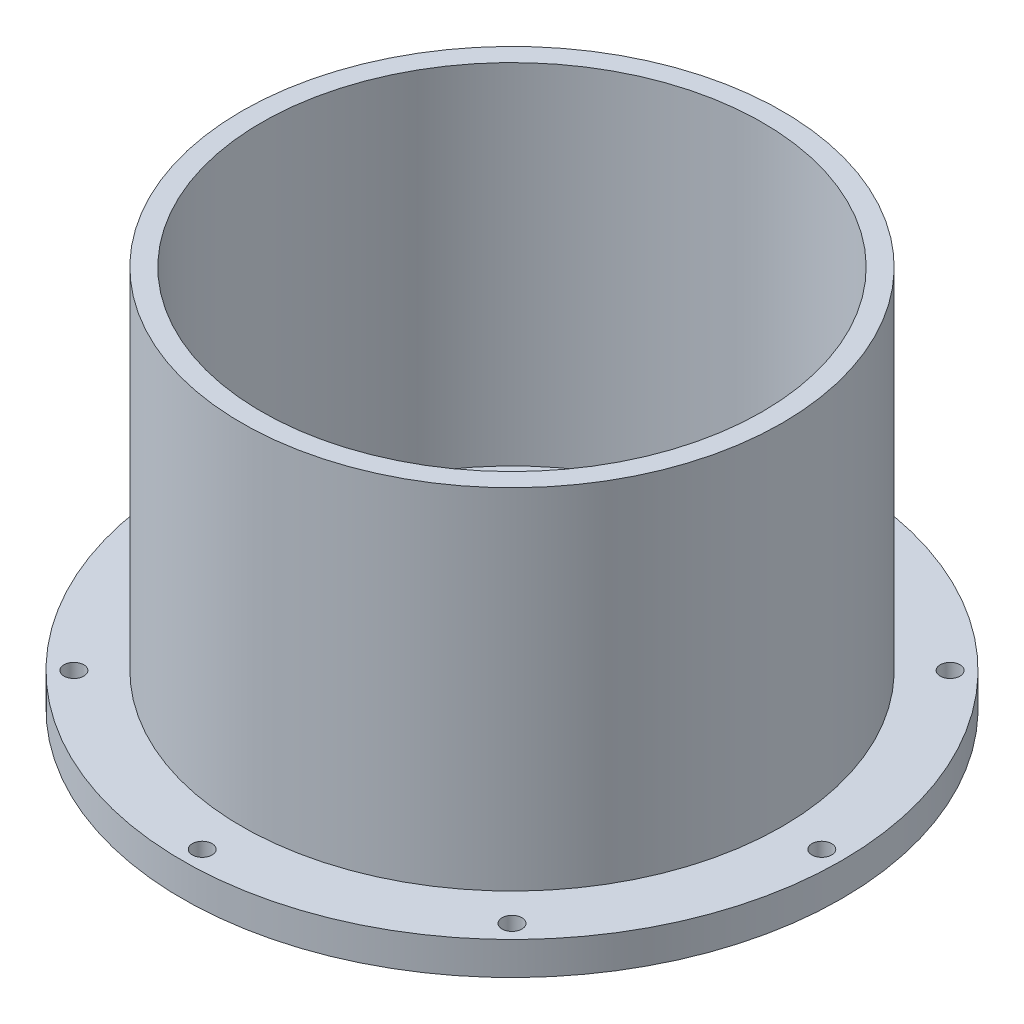
ISO-10303-21;
HEADER;
FILE_DESCRIPTION(('STEP AP214'),'2;1');
FILE_NAME('part.step','',(''),(''),'','','');
FILE_SCHEMA(('AUTOMOTIVE_DESIGN { 1 0 10303 214 1 1 1 1 }'));
ENDSEC;
DATA;
#1=APPLICATION_CONTEXT('core data for automotive mechanical design processes');
#2=APPLICATION_PROTOCOL_DEFINITION('international standard','automotive_design',2000,#1);
#3=PRODUCT_CONTEXT('',#1,'mechanical');
#4=PRODUCT('Part','Part','',(#3));
#5=PRODUCT_RELATED_PRODUCT_CATEGORY('part','',(#4));
#6=PRODUCT_DEFINITION_FORMATION('','',#4);
#7=PRODUCT_DEFINITION_CONTEXT('part definition',#1,'design');
#8=PRODUCT_DEFINITION('design','',#6,#7);
#9=PRODUCT_DEFINITION_SHAPE('','',#8);
#10=(LENGTH_UNIT() NAMED_UNIT(*) SI_UNIT(.MILLI.,.METRE.));
#11=(NAMED_UNIT(*) PLANE_ANGLE_UNIT() SI_UNIT($,.RADIAN.));
#12=(NAMED_UNIT(*) SI_UNIT($,.STERADIAN.) SOLID_ANGLE_UNIT());
#13=UNCERTAINTY_MEASURE_WITH_UNIT(LENGTH_MEASURE(1.E-05),#10,'distance_accuracy_value','');
#14=(GEOMETRIC_REPRESENTATION_CONTEXT(3) GLOBAL_UNCERTAINTY_ASSIGNED_CONTEXT((#13)) GLOBAL_UNIT_ASSIGNED_CONTEXT((#10,
#11,#12)) REPRESENTATION_CONTEXT('',''));
#15=CARTESIAN_POINT('',(0.,0.,0.));
#16=DIRECTION('',(0.,0.,1.));
#17=DIRECTION('',(1.,0.,0.));
#18=AXIS2_PLACEMENT_3D('',#15,#16,#17);
#19=CARTESIAN_POINT('',(0.,0.,0.));
#20=DIRECTION('',(0.,-1.,0.));
#21=DIRECTION('',(1.,0.,0.));
#22=AXIS2_PLACEMENT_3D('',#19,#20,#21);
#23=PLANE('',#22);
#24=CARTESIAN_POINT('',(13.5,0.,-12.));
#25=DIRECTION('',(0.,1.,0.));
#26=DIRECTION('',(-1.,0.,0.));
#27=AXIS2_PLACEMENT_3D('',#24,#25,#26);
#28=CIRCLE('',#27,1.50000000000004);
#29=CARTESIAN_POINT('',(11.9999999999999,0.,-12.));
#30=VERTEX_POINT('',#29);
#31=EDGE_CURVE('E94',#30,#30,#28,.T.);
#32=ORIENTED_EDGE('',*,*,#31,.T.);
#33=EDGE_LOOP('',(#32));
#34=FACE_BOUND('',#33,.T.);
#35=CARTESIAN_POINT('',(-13.5,0.,-12.));
#36=DIRECTION('',(0.,1.,0.));
#37=DIRECTION('',(-1.,0.,0.));
#38=AXIS2_PLACEMENT_3D('',#35,#36,#37);
#39=CIRCLE('',#38,1.50000000000004);
#40=CARTESIAN_POINT('',(-15.0000000000001,0.,-12.));
#41=VERTEX_POINT('',#40);
#42=EDGE_CURVE('E101',#41,#41,#39,.T.);
#43=ORIENTED_EDGE('',*,*,#42,.T.);
#44=EDGE_LOOP('',(#43));
#45=FACE_BOUND('',#44,.T.);
#46=CARTESIAN_POINT('',(0.,0.,47.));
#47=DIRECTION('',(0.,1.,0.));
#48=DIRECTION('',(-1.,0.,0.));
#49=AXIS2_PLACEMENT_3D('',#46,#47,#48);
#50=CIRCLE('',#49,1.5);
#51=CARTESIAN_POINT('',(-1.50000000000001,0.,47.));
#52=VERTEX_POINT('',#51);
#53=EDGE_CURVE('E107',#52,#52,#50,.T.);
#54=ORIENTED_EDGE('',*,*,#53,.T.);
#55=EDGE_LOOP('',(#54));
#56=FACE_BOUND('',#55,.T.);
#57=CARTESIAN_POINT('',(13.5000000000001,0.,12.));
#58=DIRECTION('',(0.,1.,0.));
#59=DIRECTION('',(-1.,0.,0.));
#60=AXIS2_PLACEMENT_3D('',#57,#58,#59);
#61=CIRCLE('',#60,1.50000000000004);
#62=CARTESIAN_POINT('',(12.0000000000001,0.,12.));
#63=VERTEX_POINT('',#62);
#64=EDGE_CURVE('E113',#63,#63,#61,.T.);
#65=ORIENTED_EDGE('',*,*,#64,.T.);
#66=EDGE_LOOP('',(#65));
#67=FACE_BOUND('',#66,.T.);
#68=CARTESIAN_POINT('',(13.5,0.,-4.));
#69=DIRECTION('',(0.,1.,0.));
#70=DIRECTION('',(-1.,0.,0.));
#71=AXIS2_PLACEMENT_3D('',#68,#69,#70);
#72=CIRCLE('',#71,1.50000000000004);
#73=CARTESIAN_POINT('',(11.9999999999999,0.,-4.));
#74=VERTEX_POINT('',#73);
#75=EDGE_CURVE('E77',#74,#74,#72,.T.);
#76=ORIENTED_EDGE('',*,*,#75,.T.);
#77=EDGE_LOOP('',(#76));
#78=FACE_BOUND('',#77,.T.);
#79=CARTESIAN_POINT('',(-13.4999999999999,0.,4.));
#80=DIRECTION('',(0.,1.,0.));
#81=DIRECTION('',(-1.,0.,0.));
#82=AXIS2_PLACEMENT_3D('',#79,#80,#81);
#83=CIRCLE('',#82,1.5);
#84=CARTESIAN_POINT('',(-14.9999999999999,0.,4.));
#85=VERTEX_POINT('',#84);
#86=EDGE_CURVE('E70',#85,#85,#83,.T.);
#87=ORIENTED_EDGE('',*,*,#86,.T.);
#88=EDGE_LOOP('',(#87));
#89=FACE_BOUND('',#88,.T.);
#90=CARTESIAN_POINT('',(-13.4999999999998,0.,12.));
#91=DIRECTION('',(0.,1.,0.));
#92=DIRECTION('',(-1.,0.,0.));
#93=AXIS2_PLACEMENT_3D('',#90,#91,#92);
#94=CIRCLE('',#93,1.5);
#95=CARTESIAN_POINT('',(-14.9999999999998,0.,12.));
#96=VERTEX_POINT('',#95);
#97=EDGE_CURVE('E89',#96,#96,#94,.T.);
#98=ORIENTED_EDGE('',*,*,#97,.T.);
#99=EDGE_LOOP('',(#98));
#100=FACE_BOUND('',#99,.T.);
#101=CARTESIAN_POINT('',(13.5,0.,4.));
#102=DIRECTION('',(0.,1.,0.));
#103=DIRECTION('',(-1.,0.,0.));
#104=AXIS2_PLACEMENT_3D('',#101,#102,#103);
#105=CIRCLE('',#104,1.50000000000004);
#106=CARTESIAN_POINT('',(12.,0.,4.));
#107=VERTEX_POINT('',#106);
#108=EDGE_CURVE('E82',#107,#107,#105,.T.);
#109=ORIENTED_EDGE('',*,*,#108,.T.);
#110=EDGE_LOOP('',(#109));
#111=FACE_BOUND('',#110,.T.);
#112=CARTESIAN_POINT('',(-33.2340187157677,0.,33.2340187157677));
#113=DIRECTION('',(0.,1.,0.));
#114=DIRECTION('',(-1.,0.,0.));
#115=AXIS2_PLACEMENT_3D('',#112,#113,#114);
#116=CIRCLE('',#115,1.5);
#117=CARTESIAN_POINT('',(-34.7340187157677,0.,33.2340187157677));
#118=VERTEX_POINT('',#117);
#119=EDGE_CURVE('E154',#118,#118,#116,.T.);
#120=ORIENTED_EDGE('',*,*,#119,.T.);
#121=EDGE_LOOP('',(#120));
#122=FACE_BOUND('',#121,.T.);
#123=CARTESIAN_POINT('',(-47.,0.,0.));
#124=DIRECTION('',(0.,1.,0.));
#125=DIRECTION('',(-1.,0.,0.));
#126=AXIS2_PLACEMENT_3D('',#123,#124,#125);
#127=CIRCLE('',#126,1.5);
#128=CARTESIAN_POINT('',(-48.5,0.,0.));
#129=VERTEX_POINT('',#128);
#130=EDGE_CURVE('E148',#129,#129,#127,.T.);
#131=ORIENTED_EDGE('',*,*,#130,.T.);
#132=EDGE_LOOP('',(#131));
#133=FACE_BOUND('',#132,.T.);
#134=CARTESIAN_POINT('',(-33.2340187157677,0.,-33.2340187157677));
#135=DIRECTION('',(0.,1.,0.));
#136=DIRECTION('',(-1.,0.,0.));
#137=AXIS2_PLACEMENT_3D('',#134,#135,#136);
#138=CIRCLE('',#137,1.5);
#139=CARTESIAN_POINT('',(-34.7340187157677,0.,-33.2340187157677));
#140=VERTEX_POINT('',#139);
#141=EDGE_CURVE('E142',#140,#140,#138,.T.);
#142=ORIENTED_EDGE('',*,*,#141,.T.);
#143=EDGE_LOOP('',(#142));
#144=FACE_BOUND('',#143,.T.);
#145=CARTESIAN_POINT('',(0.,0.,-47.));
#146=DIRECTION('',(0.,1.,0.));
#147=DIRECTION('',(-1.,0.,0.));
#148=AXIS2_PLACEMENT_3D('',#145,#146,#147);
#149=CIRCLE('',#148,1.5);
#150=CARTESIAN_POINT('',(-1.50000000000001,0.,-47.));
#151=VERTEX_POINT('',#150);
#152=EDGE_CURVE('E136',#151,#151,#149,.T.);
#153=ORIENTED_EDGE('',*,*,#152,.T.);
#154=EDGE_LOOP('',(#153));
#155=FACE_BOUND('',#154,.T.);
#156=CARTESIAN_POINT('',(33.2340187157677,0.,-33.2340187157677));
#157=DIRECTION('',(0.,1.,0.));
#158=DIRECTION('',(-1.,0.,0.));
#159=AXIS2_PLACEMENT_3D('',#156,#157,#158);
#160=CIRCLE('',#159,1.5);
#161=CARTESIAN_POINT('',(31.7340187157677,0.,-33.2340187157677));
#162=VERTEX_POINT('',#161);
#163=EDGE_CURVE('E130',#162,#162,#160,.T.);
#164=ORIENTED_EDGE('',*,*,#163,.T.);
#165=EDGE_LOOP('',(#164));
#166=FACE_BOUND('',#165,.T.);
#167=CARTESIAN_POINT('',(47.,0.,0.));
#168=DIRECTION('',(0.,1.,0.));
#169=DIRECTION('',(-1.,0.,0.));
#170=AXIS2_PLACEMENT_3D('',#167,#168,#169);
#171=CIRCLE('',#170,1.5);
#172=CARTESIAN_POINT('',(45.5,0.,0.));
#173=VERTEX_POINT('',#172);
#174=EDGE_CURVE('E124',#173,#173,#171,.T.);
#175=ORIENTED_EDGE('',*,*,#174,.T.);
#176=EDGE_LOOP('',(#175));
#177=FACE_BOUND('',#176,.T.);
#178=CARTESIAN_POINT('',(33.2340187157677,0.,33.2340187157677));
#179=DIRECTION('',(0.,1.,0.));
#180=DIRECTION('',(-1.,0.,0.));
#181=AXIS2_PLACEMENT_3D('',#178,#179,#180);
#182=CIRCLE('',#181,1.5);
#183=CARTESIAN_POINT('',(31.7340187157677,0.,33.2340187157677));
#184=VERTEX_POINT('',#183);
#185=EDGE_CURVE('E118',#184,#184,#182,.T.);
#186=ORIENTED_EDGE('',*,*,#185,.T.);
#187=EDGE_LOOP('',(#186));
#188=FACE_BOUND('',#187,.T.);
#189=CARTESIAN_POINT('',(-13.5,0.,-4.));
#190=DIRECTION('',(0.,1.,0.));
#191=DIRECTION('',(-1.,0.,0.));
#192=AXIS2_PLACEMENT_3D('',#189,#190,#191);
#193=CIRCLE('',#192,1.50000000000004);
#194=CARTESIAN_POINT('',(-15.0000000000001,0.,-4.));
#195=VERTEX_POINT('',#194);
#196=EDGE_CURVE('E63',#195,#195,#193,.T.);
#197=ORIENTED_EDGE('',*,*,#196,.T.);
#198=EDGE_LOOP('',(#197));
#199=FACE_BOUND('',#198,.T.);
#200=CARTESIAN_POINT('',(0.,0.,0.));
#201=DIRECTION('',(0.,-1.,0.));
#202=DIRECTION('',(1.,0.,0.));
#203=AXIS2_PLACEMENT_3D('',#200,#201,#202);
#204=CIRCLE('',#203,50.);
#205=CARTESIAN_POINT('',(50.,0.,0.));
#206=VERTEX_POINT('',#205);
#207=EDGE_CURVE('E10',#206,#206,#204,.T.);
#208=ORIENTED_EDGE('',*,*,#207,.T.);
#209=EDGE_LOOP('',(#208));
#210=FACE_BOUND('',#209,.T.);
#211=ADVANCED_FACE('F38',(#34,#45,#56,#67,#78,#89,#100,#111,#122,#133,#144,#155,#166,#177,#188,
#199,#210),#23,.T.);
#212=CARTESIAN_POINT('',(0.,0.,0.));
#213=DIRECTION('',(0.,-1.,0.));
#214=DIRECTION('',(1.,0.,0.));
#215=AXIS2_PLACEMENT_3D('',#212,#213,#214);
#216=CYLINDRICAL_SURFACE('',#215,50.);
#217=CARTESIAN_POINT('',(0.,5.,0.));
#218=DIRECTION('',(0.,-1.,0.));
#219=DIRECTION('',(1.,0.,0.));
#220=AXIS2_PLACEMENT_3D('',#217,#218,#219);
#221=CIRCLE('',#220,50.);
#222=CARTESIAN_POINT('',(50.,5.,0.));
#223=VERTEX_POINT('',#222);
#224=EDGE_CURVE('E44',#223,#223,#221,.T.);
#225=ORIENTED_EDGE('',*,*,#224,.T.);
#226=EDGE_LOOP('',(#225));
#227=FACE_BOUND('',#226,.T.);
#228=ORIENTED_EDGE('',*,*,#207,.F.);
#229=EDGE_LOOP('',(#228));
#230=FACE_BOUND('',#229,.T.);
#231=ADVANCED_FACE('F166',(#227,#230),#216,.T.);
#232=CARTESIAN_POINT('',(50.,5.,0.));
#233=DIRECTION('',(0.,1.,0.));
#234=DIRECTION('',(-1.,0.,0.));
#235=AXIS2_PLACEMENT_3D('',#232,#233,#234);
#236=PLANE('',#235);
#237=CARTESIAN_POINT('',(0.,5.,47.));
#238=DIRECTION('',(0.,1.,0.));
#239=DIRECTION('',(-1.,0.,0.));
#240=AXIS2_PLACEMENT_3D('',#237,#238,#239);
#241=CIRCLE('',#240,1.5);
#242=CARTESIAN_POINT('',(-1.50000000000001,5.,47.));
#243=VERTEX_POINT('',#242);
#244=EDGE_CURVE('E110',#243,#243,#241,.T.);
#245=ORIENTED_EDGE('',*,*,#244,.F.);
#246=EDGE_LOOP('',(#245));
#247=FACE_BOUND('',#246,.T.);
#248=CARTESIAN_POINT('',(-33.2340187157677,5.,33.2340187157677));
#249=DIRECTION('',(0.,1.,0.));
#250=DIRECTION('',(-1.,0.,0.));
#251=AXIS2_PLACEMENT_3D('',#248,#249,#250);
#252=CIRCLE('',#251,1.5);
#253=CARTESIAN_POINT('',(-34.7340187157677,5.,33.2340187157677));
#254=VERTEX_POINT('',#253);
#255=EDGE_CURVE('E98',#254,#254,#252,.T.);
#256=ORIENTED_EDGE('',*,*,#255,.F.);
#257=EDGE_LOOP('',(#256));
#258=FACE_BOUND('',#257,.T.);
#259=CARTESIAN_POINT('',(-47.,5.,0.));
#260=DIRECTION('',(0.,1.,0.));
#261=DIRECTION('',(-1.,0.,0.));
#262=AXIS2_PLACEMENT_3D('',#259,#260,#261);
#263=CIRCLE('',#262,1.5);
#264=CARTESIAN_POINT('',(-48.5,5.,0.));
#265=VERTEX_POINT('',#264);
#266=EDGE_CURVE('E151',#265,#265,#263,.T.);
#267=ORIENTED_EDGE('',*,*,#266,.F.);
#268=EDGE_LOOP('',(#267));
#269=FACE_BOUND('',#268,.T.);
#270=CARTESIAN_POINT('',(-33.2340187157677,5.,-33.2340187157677));
#271=DIRECTION('',(0.,1.,0.));
#272=DIRECTION('',(-1.,0.,0.));
#273=AXIS2_PLACEMENT_3D('',#270,#271,#272);
#274=CIRCLE('',#273,1.5);
#275=CARTESIAN_POINT('',(-34.7340187157677,5.,-33.2340187157677));
#276=VERTEX_POINT('',#275);
#277=EDGE_CURVE('E145',#276,#276,#274,.T.);
#278=ORIENTED_EDGE('',*,*,#277,.F.);
#279=EDGE_LOOP('',(#278));
#280=FACE_BOUND('',#279,.T.);
#281=CARTESIAN_POINT('',(0.,5.,-47.));
#282=DIRECTION('',(0.,1.,0.));
#283=DIRECTION('',(-1.,0.,0.));
#284=AXIS2_PLACEMENT_3D('',#281,#282,#283);
#285=CIRCLE('',#284,1.5);
#286=CARTESIAN_POINT('',(-1.50000000000001,5.,-47.));
#287=VERTEX_POINT('',#286);
#288=EDGE_CURVE('E139',#287,#287,#285,.T.);
#289=ORIENTED_EDGE('',*,*,#288,.F.);
#290=EDGE_LOOP('',(#289));
#291=FACE_BOUND('',#290,.T.);
#292=CARTESIAN_POINT('',(33.2340187157677,5.,-33.2340187157677));
#293=DIRECTION('',(0.,1.,0.));
#294=DIRECTION('',(-1.,0.,0.));
#295=AXIS2_PLACEMENT_3D('',#292,#293,#294);
#296=CIRCLE('',#295,1.5);
#297=CARTESIAN_POINT('',(31.7340187157677,5.,-33.2340187157677));
#298=VERTEX_POINT('',#297);
#299=EDGE_CURVE('E133',#298,#298,#296,.T.);
#300=ORIENTED_EDGE('',*,*,#299,.F.);
#301=EDGE_LOOP('',(#300));
#302=FACE_BOUND('',#301,.T.);
#303=CARTESIAN_POINT('',(47.,5.,0.));
#304=DIRECTION('',(0.,1.,0.));
#305=DIRECTION('',(-1.,0.,0.));
#306=AXIS2_PLACEMENT_3D('',#303,#304,#305);
#307=CIRCLE('',#306,1.5);
#308=CARTESIAN_POINT('',(45.5,5.,0.));
#309=VERTEX_POINT('',#308);
#310=EDGE_CURVE('E127',#309,#309,#307,.T.);
#311=ORIENTED_EDGE('',*,*,#310,.F.);
#312=EDGE_LOOP('',(#311));
#313=FACE_BOUND('',#312,.T.);
#314=CARTESIAN_POINT('',(33.2340187157677,5.,33.2340187157677));
#315=DIRECTION('',(0.,1.,0.));
#316=DIRECTION('',(-1.,0.,0.));
#317=AXIS2_PLACEMENT_3D('',#314,#315,#316);
#318=CIRCLE('',#317,1.5);
#319=CARTESIAN_POINT('',(31.7340187157677,5.,33.2340187157677));
#320=VERTEX_POINT('',#319);
#321=EDGE_CURVE('E121',#320,#320,#318,.T.);
#322=ORIENTED_EDGE('',*,*,#321,.F.);
#323=EDGE_LOOP('',(#322));
#324=FACE_BOUND('',#323,.T.);
#325=CARTESIAN_POINT('',(0.,5.,0.));
#326=DIRECTION('',(0.,-1.,0.));
#327=DIRECTION('',(1.,0.,0.));
#328=AXIS2_PLACEMENT_3D('',#325,#326,#327);
#329=CIRCLE('',#328,41.);
#330=CARTESIAN_POINT('',(41.,5.,0.));
#331=VERTEX_POINT('',#330);
#332=EDGE_CURVE('E48',#331,#331,#329,.T.);
#333=ORIENTED_EDGE('',*,*,#332,.T.);
#334=EDGE_LOOP('',(#333));
#335=FACE_BOUND('',#334,.T.);
#336=ORIENTED_EDGE('',*,*,#224,.F.);
#337=EDGE_LOOP('',(#336));
#338=FACE_BOUND('',#337,.T.);
#339=ADVANCED_FACE('F162',(#247,#258,#269,#280,#291,#302,#313,#324,#335,#338),#236,.T.);
#340=CARTESIAN_POINT('',(0.,0.,0.));
#341=DIRECTION('',(0.,-1.,0.));
#342=DIRECTION('',(1.,0.,0.));
#343=AXIS2_PLACEMENT_3D('',#340,#341,#342);
#344=CYLINDRICAL_SURFACE('',#343,41.);
#345=CARTESIAN_POINT('',(0.,58.,0.));
#346=DIRECTION('',(0.,-1.,0.));
#347=DIRECTION('',(1.,0.,0.));
#348=AXIS2_PLACEMENT_3D('',#345,#346,#347);
#349=CIRCLE('',#348,41.);
#350=CARTESIAN_POINT('',(41.,58.,0.));
#351=VERTEX_POINT('',#350);
#352=EDGE_CURVE('E52',#351,#351,#349,.T.);
#353=ORIENTED_EDGE('',*,*,#352,.T.);
#354=EDGE_LOOP('',(#353));
#355=FACE_BOUND('',#354,.T.);
#356=ORIENTED_EDGE('',*,*,#332,.F.);
#357=EDGE_LOOP('',(#356));
#358=FACE_BOUND('',#357,.T.);
#359=ADVANCED_FACE('F165',(#355,#358),#344,.T.);
#360=CARTESIAN_POINT('',(41.,58.,0.));
#361=DIRECTION('',(0.,1.,0.));
#362=DIRECTION('',(-1.,0.,0.));
#363=AXIS2_PLACEMENT_3D('',#360,#361,#362);
#364=PLANE('',#363);
#365=CARTESIAN_POINT('',(0.,58.,0.));
#366=DIRECTION('',(0.,-1.,0.));
#367=DIRECTION('',(1.,0.,0.));
#368=AXIS2_PLACEMENT_3D('',#365,#366,#367);
#369=CIRCLE('',#368,38.);
#370=CARTESIAN_POINT('',(38.,58.,0.));
#371=VERTEX_POINT('',#370);
#372=EDGE_CURVE('E57',#371,#371,#369,.T.);
#373=ORIENTED_EDGE('',*,*,#372,.T.);
#374=EDGE_LOOP('',(#373));
#375=FACE_BOUND('',#374,.T.);
#376=ORIENTED_EDGE('',*,*,#352,.F.);
#377=EDGE_LOOP('',(#376));
#378=FACE_BOUND('',#377,.T.);
#379=ADVANCED_FACE('F185',(#375,#378),#364,.T.);
#380=CARTESIAN_POINT('',(0.,0.,0.));
#381=DIRECTION('',(0.,-1.,0.));
#382=DIRECTION('',(1.,0.,0.));
#383=AXIS2_PLACEMENT_3D('',#380,#381,#382);
#384=CYLINDRICAL_SURFACE('',#383,38.);
#385=CARTESIAN_POINT('',(0.,5.,0.));
#386=DIRECTION('',(0.,-1.,0.));
#387=DIRECTION('',(1.,0.,0.));
#388=AXIS2_PLACEMENT_3D('',#385,#386,#387);
#389=CIRCLE('',#388,38.);
#390=CARTESIAN_POINT('',(38.,5.,0.));
#391=VERTEX_POINT('',#390);
#392=EDGE_CURVE('E60',#391,#391,#389,.T.);
#393=ORIENTED_EDGE('',*,*,#392,.T.);
#394=EDGE_LOOP('',(#393));
#395=FACE_BOUND('',#394,.T.);
#396=ORIENTED_EDGE('',*,*,#372,.F.);
#397=EDGE_LOOP('',(#396));
#398=FACE_BOUND('',#397,.T.);
#399=ADVANCED_FACE('F191',(#395,#398),#384,.F.);
#400=CARTESIAN_POINT('',(38.,5.,0.));
#401=DIRECTION('',(0.,1.,0.));
#402=DIRECTION('',(-1.,0.,0.));
#403=AXIS2_PLACEMENT_3D('',#400,#401,#402);
#404=PLANE('',#403);
#405=CARTESIAN_POINT('',(13.5,5.,-12.));
#406=DIRECTION('',(0.,1.,0.));
#407=DIRECTION('',(-1.,0.,0.));
#408=AXIS2_PLACEMENT_3D('',#405,#406,#407);
#409=CIRCLE('',#408,1.50000000000004);
#410=CARTESIAN_POINT('',(11.9999999999999,5.,-12.));
#411=VERTEX_POINT('',#410);
#412=EDGE_CURVE('E97',#411,#411,#409,.T.);
#413=ORIENTED_EDGE('',*,*,#412,.F.);
#414=EDGE_LOOP('',(#413));
#415=FACE_BOUND('',#414,.T.);
#416=CARTESIAN_POINT('',(-13.5,5.,-12.));
#417=DIRECTION('',(0.,1.,0.));
#418=DIRECTION('',(-1.,0.,0.));
#419=AXIS2_PLACEMENT_3D('',#416,#417,#418);
#420=CIRCLE('',#419,1.50000000000004);
#421=CARTESIAN_POINT('',(-15.0000000000001,5.,-12.));
#422=VERTEX_POINT('',#421);
#423=EDGE_CURVE('E104',#422,#422,#420,.T.);
#424=ORIENTED_EDGE('',*,*,#423,.F.);
#425=EDGE_LOOP('',(#424));
#426=FACE_BOUND('',#425,.T.);
#427=CARTESIAN_POINT('',(13.5000000000001,5.,12.));
#428=DIRECTION('',(0.,1.,0.));
#429=DIRECTION('',(-1.,0.,0.));
#430=AXIS2_PLACEMENT_3D('',#427,#428,#429);
#431=CIRCLE('',#430,1.50000000000004);
#432=CARTESIAN_POINT('',(12.0000000000001,5.,12.));
#433=VERTEX_POINT('',#432);
#434=EDGE_CURVE('E86',#433,#433,#431,.T.);
#435=ORIENTED_EDGE('',*,*,#434,.F.);
#436=EDGE_LOOP('',(#435));
#437=FACE_BOUND('',#436,.T.);
#438=CARTESIAN_POINT('',(13.5,5.,-4.));
#439=DIRECTION('',(0.,1.,0.));
#440=DIRECTION('',(-1.,0.,0.));
#441=AXIS2_PLACEMENT_3D('',#438,#439,#440);
#442=CIRCLE('',#441,1.50000000000004);
#443=CARTESIAN_POINT('',(11.9999999999999,5.,-4.));
#444=VERTEX_POINT('',#443);
#445=EDGE_CURVE('E67',#444,#444,#442,.T.);
#446=ORIENTED_EDGE('',*,*,#445,.F.);
#447=EDGE_LOOP('',(#446));
#448=FACE_BOUND('',#447,.T.);
#449=CARTESIAN_POINT('',(-13.4999999999999,5.,4.));
#450=DIRECTION('',(0.,1.,0.));
#451=DIRECTION('',(-1.,0.,0.));
#452=AXIS2_PLACEMENT_3D('',#449,#450,#451);
#453=CIRCLE('',#452,1.5);
#454=CARTESIAN_POINT('',(-14.9999999999999,5.,4.));
#455=VERTEX_POINT('',#454);
#456=EDGE_CURVE('E73',#455,#455,#453,.T.);
#457=ORIENTED_EDGE('',*,*,#456,.F.);
#458=EDGE_LOOP('',(#457));
#459=FACE_BOUND('',#458,.T.);
#460=CARTESIAN_POINT('',(-13.4999999999998,5.,12.));
#461=DIRECTION('',(0.,1.,0.));
#462=DIRECTION('',(-1.,0.,0.));
#463=AXIS2_PLACEMENT_3D('',#460,#461,#462);
#464=CIRCLE('',#463,1.5);
#465=CARTESIAN_POINT('',(-14.9999999999998,5.,12.));
#466=VERTEX_POINT('',#465);
#467=EDGE_CURVE('E74',#466,#466,#464,.T.);
#468=ORIENTED_EDGE('',*,*,#467,.F.);
#469=EDGE_LOOP('',(#468));
#470=FACE_BOUND('',#469,.T.);
#471=CARTESIAN_POINT('',(13.5,5.,4.));
#472=DIRECTION('',(0.,1.,0.));
#473=DIRECTION('',(-1.,0.,0.));
#474=AXIS2_PLACEMENT_3D('',#471,#472,#473);
#475=CIRCLE('',#474,1.50000000000004);
#476=CARTESIAN_POINT('',(12.,5.,4.));
#477=VERTEX_POINT('',#476);
#478=EDGE_CURVE('E85',#477,#477,#475,.T.);
#479=ORIENTED_EDGE('',*,*,#478,.F.);
#480=EDGE_LOOP('',(#479));
#481=FACE_BOUND('',#480,.T.);
#482=CARTESIAN_POINT('',(-13.5,5.,-4.));
#483=DIRECTION('',(0.,1.,0.));
#484=DIRECTION('',(-1.,0.,0.));
#485=AXIS2_PLACEMENT_3D('',#482,#483,#484);
#486=CIRCLE('',#485,1.50000000000004);
#487=CARTESIAN_POINT('',(-15.0000000000001,5.,-4.));
#488=VERTEX_POINT('',#487);
#489=EDGE_CURVE('E64',#488,#488,#486,.T.);
#490=ORIENTED_EDGE('',*,*,#489,.F.);
#491=EDGE_LOOP('',(#490));
#492=FACE_BOUND('',#491,.T.);
#493=ORIENTED_EDGE('',*,*,#392,.F.);
#494=EDGE_LOOP('',(#493));
#495=FACE_BOUND('',#494,.T.);
#496=ADVANCED_FACE('F235',(#415,#426,#437,#448,#459,#470,#481,#492,#495),#404,.T.);
#497=CARTESIAN_POINT('',(-13.5,0.,-4.));
#498=DIRECTION('',(0.,1.,0.));
#499=DIRECTION('',(-1.,0.,0.));
#500=AXIS2_PLACEMENT_3D('',#497,#498,#499);
#501=CYLINDRICAL_SURFACE('',#500,1.50000000000004);
#502=ORIENTED_EDGE('',*,*,#196,.F.);
#503=EDGE_LOOP('',(#502));
#504=FACE_BOUND('',#503,.T.);
#505=ORIENTED_EDGE('',*,*,#489,.T.);
#506=EDGE_LOOP('',(#505));
#507=FACE_BOUND('',#506,.T.);
#508=ADVANCED_FACE('F231',(#504,#507),#501,.F.);
#509=CARTESIAN_POINT('',(13.5,0.,4.));
#510=DIRECTION('',(0.,1.,0.));
#511=DIRECTION('',(-1.,0.,0.));
#512=AXIS2_PLACEMENT_3D('',#509,#510,#511);
#513=CYLINDRICAL_SURFACE('',#512,1.50000000000004);
#514=ORIENTED_EDGE('',*,*,#108,.F.);
#515=EDGE_LOOP('',(#514));
#516=FACE_BOUND('',#515,.T.);
#517=ORIENTED_EDGE('',*,*,#478,.T.);
#518=EDGE_LOOP('',(#517));
#519=FACE_BOUND('',#518,.T.);
#520=ADVANCED_FACE('F234',(#516,#519),#513,.F.);
#521=CARTESIAN_POINT('',(-13.4999999999998,0.,12.));
#522=DIRECTION('',(0.,1.,0.));
#523=DIRECTION('',(-1.,0.,0.));
#524=AXIS2_PLACEMENT_3D('',#521,#522,#523);
#525=CYLINDRICAL_SURFACE('',#524,1.5);
#526=ORIENTED_EDGE('',*,*,#97,.F.);
#527=EDGE_LOOP('',(#526));
#528=FACE_BOUND('',#527,.T.);
#529=ORIENTED_EDGE('',*,*,#467,.T.);
#530=EDGE_LOOP('',(#529));
#531=FACE_BOUND('',#530,.T.);
#532=ADVANCED_FACE('F258',(#528,#531),#525,.F.);
#533=CARTESIAN_POINT('',(-13.4999999999999,0.,4.));
#534=DIRECTION('',(0.,1.,0.));
#535=DIRECTION('',(-1.,0.,0.));
#536=AXIS2_PLACEMENT_3D('',#533,#534,#535);
#537=CYLINDRICAL_SURFACE('',#536,1.5);
#538=ORIENTED_EDGE('',*,*,#86,.F.);
#539=EDGE_LOOP('',(#538));
#540=FACE_BOUND('',#539,.T.);
#541=ORIENTED_EDGE('',*,*,#456,.T.);
#542=EDGE_LOOP('',(#541));
#543=FACE_BOUND('',#542,.T.);
#544=ADVANCED_FACE('F254',(#540,#543),#537,.F.);
#545=CARTESIAN_POINT('',(13.5,0.,-4.));
#546=DIRECTION('',(0.,1.,0.));
#547=DIRECTION('',(-1.,0.,0.));
#548=AXIS2_PLACEMENT_3D('',#545,#546,#547);
#549=CYLINDRICAL_SURFACE('',#548,1.50000000000004);
#550=ORIENTED_EDGE('',*,*,#75,.F.);
#551=EDGE_LOOP('',(#550));
#552=FACE_BOUND('',#551,.T.);
#553=ORIENTED_EDGE('',*,*,#445,.T.);
#554=EDGE_LOOP('',(#553));
#555=FACE_BOUND('',#554,.T.);
#556=ADVANCED_FACE('F257',(#552,#555),#549,.F.);
#557=CARTESIAN_POINT('',(13.5000000000001,0.,12.));
#558=DIRECTION('',(0.,1.,0.));
#559=DIRECTION('',(-1.,0.,0.));
#560=AXIS2_PLACEMENT_3D('',#557,#558,#559);
#561=CYLINDRICAL_SURFACE('',#560,1.50000000000004);
#562=ORIENTED_EDGE('',*,*,#64,.F.);
#563=EDGE_LOOP('',(#562));
#564=FACE_BOUND('',#563,.T.);
#565=ORIENTED_EDGE('',*,*,#434,.T.);
#566=EDGE_LOOP('',(#565));
#567=FACE_BOUND('',#566,.T.);
#568=ADVANCED_FACE('F262',(#564,#567),#561,.F.);
#569=CARTESIAN_POINT('',(-13.5,0.,-12.));
#570=DIRECTION('',(0.,1.,0.));
#571=DIRECTION('',(-1.,0.,0.));
#572=AXIS2_PLACEMENT_3D('',#569,#570,#571);
#573=CYLINDRICAL_SURFACE('',#572,1.50000000000004);
#574=ORIENTED_EDGE('',*,*,#42,.F.);
#575=EDGE_LOOP('',(#574));
#576=FACE_BOUND('',#575,.T.);
#577=ORIENTED_EDGE('',*,*,#423,.T.);
#578=EDGE_LOOP('',(#577));
#579=FACE_BOUND('',#578,.T.);
#580=ADVANCED_FACE('F274',(#576,#579),#573,.F.);
#581=CARTESIAN_POINT('',(13.5,0.,-12.));
#582=DIRECTION('',(0.,1.,0.));
#583=DIRECTION('',(-1.,0.,0.));
#584=AXIS2_PLACEMENT_3D('',#581,#582,#583);
#585=CYLINDRICAL_SURFACE('',#584,1.50000000000004);
#586=ORIENTED_EDGE('',*,*,#31,.F.);
#587=EDGE_LOOP('',(#586));
#588=FACE_BOUND('',#587,.T.);
#589=ORIENTED_EDGE('',*,*,#412,.T.);
#590=EDGE_LOOP('',(#589));
#591=FACE_BOUND('',#590,.T.);
#592=ADVANCED_FACE('F270',(#588,#591),#585,.F.);
#593=CARTESIAN_POINT('',(33.2340187157677,0.,33.2340187157677));
#594=DIRECTION('',(0.,1.,0.));
#595=DIRECTION('',(-1.,0.,0.));
#596=AXIS2_PLACEMENT_3D('',#593,#594,#595);
#597=CYLINDRICAL_SURFACE('',#596,1.5);
#598=ORIENTED_EDGE('',*,*,#185,.F.);
#599=EDGE_LOOP('',(#598));
#600=FACE_BOUND('',#599,.T.);
#601=ORIENTED_EDGE('',*,*,#321,.T.);
#602=EDGE_LOOP('',(#601));
#603=FACE_BOUND('',#602,.T.);
#604=ADVANCED_FACE('F273',(#600,#603),#597,.F.);
#605=CARTESIAN_POINT('',(47.,0.,0.));
#606=DIRECTION('',(0.,1.,0.));
#607=DIRECTION('',(-1.,0.,0.));
#608=AXIS2_PLACEMENT_3D('',#605,#606,#607);
#609=CYLINDRICAL_SURFACE('',#608,1.5);
#610=ORIENTED_EDGE('',*,*,#174,.F.);
#611=EDGE_LOOP('',(#610));
#612=FACE_BOUND('',#611,.T.);
#613=ORIENTED_EDGE('',*,*,#310,.T.);
#614=EDGE_LOOP('',(#613));
#615=FACE_BOUND('',#614,.T.);
#616=ADVANCED_FACE('F288',(#612,#615),#609,.F.);
#617=CARTESIAN_POINT('',(33.2340187157677,0.,-33.2340187157677));
#618=DIRECTION('',(0.,1.,0.));
#619=DIRECTION('',(-1.,0.,0.));
#620=AXIS2_PLACEMENT_3D('',#617,#618,#619);
#621=CYLINDRICAL_SURFACE('',#620,1.5);
#622=ORIENTED_EDGE('',*,*,#163,.F.);
#623=EDGE_LOOP('',(#622));
#624=FACE_BOUND('',#623,.T.);
#625=ORIENTED_EDGE('',*,*,#299,.T.);
#626=EDGE_LOOP('',(#625));
#627=FACE_BOUND('',#626,.T.);
#628=ADVANCED_FACE('F292',(#624,#627),#621,.F.);
#629=CARTESIAN_POINT('',(0.,0.,-47.));
#630=DIRECTION('',(0.,1.,0.));
#631=DIRECTION('',(-1.,0.,0.));
#632=AXIS2_PLACEMENT_3D('',#629,#630,#631);
#633=CYLINDRICAL_SURFACE('',#632,1.5);
#634=ORIENTED_EDGE('',*,*,#152,.F.);
#635=EDGE_LOOP('',(#634));
#636=FACE_BOUND('',#635,.T.);
#637=ORIENTED_EDGE('',*,*,#288,.T.);
#638=EDGE_LOOP('',(#637));
#639=FACE_BOUND('',#638,.T.);
#640=ADVANCED_FACE('F296',(#636,#639),#633,.F.);
#641=CARTESIAN_POINT('',(-33.2340187157677,0.,-33.2340187157677));
#642=DIRECTION('',(0.,1.,0.));
#643=DIRECTION('',(-1.,0.,0.));
#644=AXIS2_PLACEMENT_3D('',#641,#642,#643);
#645=CYLINDRICAL_SURFACE('',#644,1.5);
#646=ORIENTED_EDGE('',*,*,#141,.F.);
#647=EDGE_LOOP('',(#646));
#648=FACE_BOUND('',#647,.T.);
#649=ORIENTED_EDGE('',*,*,#277,.T.);
#650=EDGE_LOOP('',(#649));
#651=FACE_BOUND('',#650,.T.);
#652=ADVANCED_FACE('F300',(#648,#651),#645,.F.);
#653=CARTESIAN_POINT('',(-47.,0.,0.));
#654=DIRECTION('',(0.,1.,0.));
#655=DIRECTION('',(-1.,0.,0.));
#656=AXIS2_PLACEMENT_3D('',#653,#654,#655);
#657=CYLINDRICAL_SURFACE('',#656,1.5);
#658=ORIENTED_EDGE('',*,*,#130,.F.);
#659=EDGE_LOOP('',(#658));
#660=FACE_BOUND('',#659,.T.);
#661=ORIENTED_EDGE('',*,*,#266,.T.);
#662=EDGE_LOOP('',(#661));
#663=FACE_BOUND('',#662,.T.);
#664=ADVANCED_FACE('F304',(#660,#663),#657,.F.);
#665=CARTESIAN_POINT('',(-33.2340187157677,0.,33.2340187157677));
#666=DIRECTION('',(0.,1.,0.));
#667=DIRECTION('',(-1.,0.,0.));
#668=AXIS2_PLACEMENT_3D('',#665,#666,#667);
#669=CYLINDRICAL_SURFACE('',#668,1.5);
#670=ORIENTED_EDGE('',*,*,#119,.F.);
#671=EDGE_LOOP('',(#670));
#672=FACE_BOUND('',#671,.T.);
#673=ORIENTED_EDGE('',*,*,#255,.T.);
#674=EDGE_LOOP('',(#673));
#675=FACE_BOUND('',#674,.T.);
#676=ADVANCED_FACE('F160',(#672,#675),#669,.F.);
#677=CARTESIAN_POINT('',(0.,0.,47.));
#678=DIRECTION('',(0.,1.,0.));
#679=DIRECTION('',(-1.,0.,0.));
#680=AXIS2_PLACEMENT_3D('',#677,#678,#679);
#681=CYLINDRICAL_SURFACE('',#680,1.5);
#682=ORIENTED_EDGE('',*,*,#53,.F.);
#683=EDGE_LOOP('',(#682));
#684=FACE_BOUND('',#683,.T.);
#685=ORIENTED_EDGE('',*,*,#244,.T.);
#686=EDGE_LOOP('',(#685));
#687=FACE_BOUND('',#686,.T.);
#688=ADVANCED_FACE('F279',(#684,#687),#681,.F.);
#689=CLOSED_SHELL('',(#211,#231,#339,#359,#379,#399,#496,#508,#520,#532,#544,#556,#568,#580,
#592,#604,#616,#628,#640,#652,#664,#676,#688));
#690=MANIFOLD_SOLID_BREP('B2',#689);
#691=ADVANCED_BREP_SHAPE_REPRESENTATION('',(#18,#690),#14);
#692=SHAPE_DEFINITION_REPRESENTATION(#9,#691);
ENDSEC;
END-ISO-10303-21;
